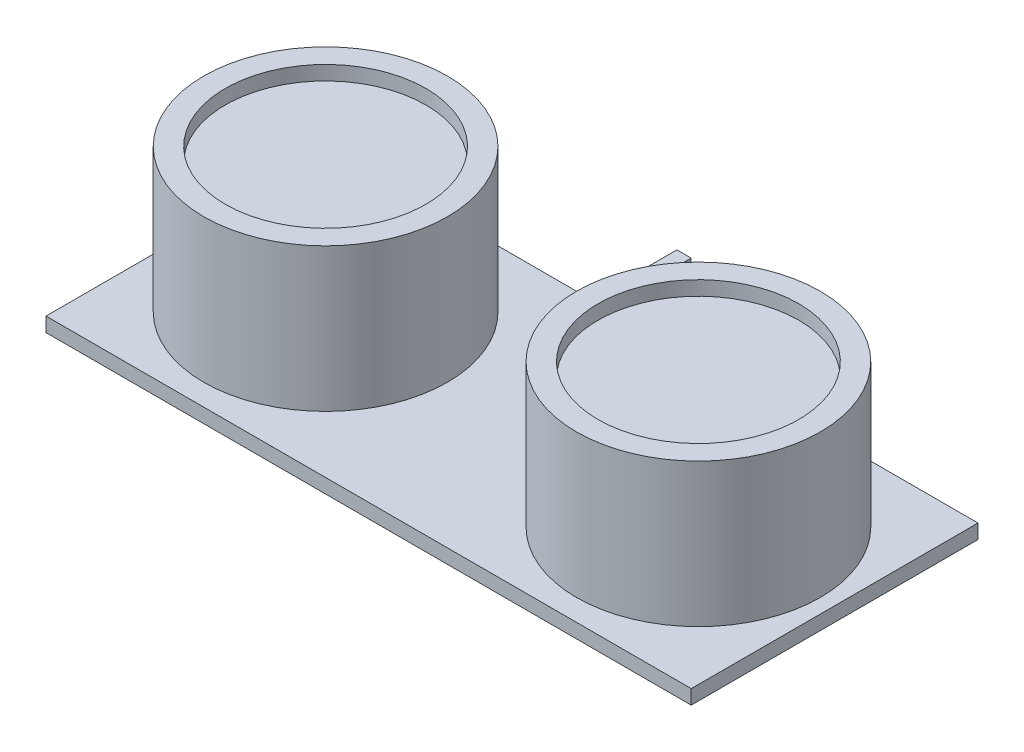
ISO-10303-21;
HEADER;
FILE_DESCRIPTION(('STEP AP214'),'2;1');
FILE_NAME('part.step','',(''),(''),'','','');
FILE_SCHEMA(('AUTOMOTIVE_DESIGN { 1 0 10303 214 1 1 1 1 }'));
ENDSEC;
DATA;
#1=APPLICATION_CONTEXT('core data for automotive mechanical design processes');
#2=APPLICATION_PROTOCOL_DEFINITION('international standard','automotive_design',2000,#1);
#3=PRODUCT_CONTEXT('',#1,'mechanical');
#4=PRODUCT('Part','Part','',(#3));
#5=PRODUCT_RELATED_PRODUCT_CATEGORY('part','',(#4));
#6=PRODUCT_DEFINITION_FORMATION('','',#4);
#7=PRODUCT_DEFINITION_CONTEXT('part definition',#1,'design');
#8=PRODUCT_DEFINITION('design','',#6,#7);
#9=PRODUCT_DEFINITION_SHAPE('','',#8);
#10=(LENGTH_UNIT() NAMED_UNIT(*) SI_UNIT(.MILLI.,.METRE.));
#11=(NAMED_UNIT(*) PLANE_ANGLE_UNIT() SI_UNIT($,.RADIAN.));
#12=(NAMED_UNIT(*) SI_UNIT($,.STERADIAN.) SOLID_ANGLE_UNIT());
#13=UNCERTAINTY_MEASURE_WITH_UNIT(LENGTH_MEASURE(1.E-05),#10,'distance_accuracy_value','');
#14=(GEOMETRIC_REPRESENTATION_CONTEXT(3) GLOBAL_UNCERTAINTY_ASSIGNED_CONTEXT((#13)) GLOBAL_UNIT_ASSIGNED_CONTEXT((#10,
#11,#12)) REPRESENTATION_CONTEXT('',''));
#15=CARTESIAN_POINT('',(0.,0.,0.));
#16=DIRECTION('',(0.,0.,1.));
#17=DIRECTION('',(1.,0.,0.));
#18=AXIS2_PLACEMENT_3D('',#15,#16,#17);
#19=CARTESIAN_POINT('',(0.,1.,0.));
#20=DIRECTION('',(0.,1.,0.));
#21=DIRECTION('',(0.,0.,1.));
#22=AXIS2_PLACEMENT_3D('',#19,#20,#21);
#23=PLANE('',#22);
#24=CARTESIAN_POINT('',(-13.,1.,0.));
#25=DIRECTION('',(0.,1.,0.));
#26=DIRECTION('',(0.,0.,1.));
#27=AXIS2_PLACEMENT_3D('',#24,#25,#26);
#28=CIRCLE('',#27,8.5);
#29=CARTESIAN_POINT('',(-13.,1.,8.5));
#30=VERTEX_POINT('',#29);
#31=EDGE_CURVE('E345',#30,#30,#28,.T.);
#32=ORIENTED_EDGE('',*,*,#31,.F.);
#33=EDGE_LOOP('',(#32));
#34=FACE_BOUND('',#33,.T.);
#35=CARTESIAN_POINT('',(13.,1.,0.));
#36=DIRECTION('',(0.,1.,0.));
#37=DIRECTION('',(0.,0.,1.));
#38=AXIS2_PLACEMENT_3D('',#35,#36,#37);
#39=CIRCLE('',#38,8.5);
#40=CARTESIAN_POINT('',(13.,1.,8.5));
#41=VERTEX_POINT('',#40);
#42=EDGE_CURVE('E339',#41,#41,#39,.T.);
#43=ORIENTED_EDGE('',*,*,#42,.F.);
#44=EDGE_LOOP('',(#43));
#45=FACE_BOUND('',#44,.T.);
#46=DIRECTION('',(1.,0.,0.));
#47=VECTOR('',#46,1.);
#48=CARTESIAN_POINT('',(0.500000000000001,1.,-8.));
#49=LINE('',#48,#47);
#50=CARTESIAN_POINT('',(0.500000000000001,1.,-8.));
#51=VERTEX_POINT('',#50);
#52=CARTESIAN_POINT('',(1.5,1.,-8.));
#53=VERTEX_POINT('',#52);
#54=EDGE_CURVE('E50',#51,#53,#49,.T.);
#55=ORIENTED_EDGE('',*,*,#54,.F.);
#56=DIRECTION('',(0.,0.,1.));
#57=VECTOR('',#56,1.);
#58=CARTESIAN_POINT('',(0.5,1.,-15.));
#59=LINE('',#58,#57);
#60=CARTESIAN_POINT('',(0.500000000000001,1.,-10.));
#61=VERTEX_POINT('',#60);
#62=EDGE_CURVE('E219',#61,#51,#59,.T.);
#63=ORIENTED_EDGE('',*,*,#62,.F.);
#64=DIRECTION('',(-1.,0.,0.));
#65=VECTOR('',#64,1.);
#66=CARTESIAN_POINT('',(-22.5,1.,-10.));
#67=LINE('',#66,#65);
#68=CARTESIAN_POINT('',(-0.500000000000007,1.,-10.));
#69=VERTEX_POINT('',#68);
#70=EDGE_CURVE('E368',#61,#69,#67,.T.);
#71=ORIENTED_EDGE('',*,*,#70,.T.);
#72=DIRECTION('',(0.,0.,-1.));
#73=VECTOR('',#72,1.);
#74=CARTESIAN_POINT('',(-0.5,1.,-15.));
#75=LINE('',#74,#73);
#76=CARTESIAN_POINT('',(-0.499999999999999,1.,-8.));
#77=VERTEX_POINT('',#76);
#78=EDGE_CURVE('E245',#77,#69,#75,.T.);
#79=ORIENTED_EDGE('',*,*,#78,.F.);
#80=DIRECTION('',(1.,0.,0.));
#81=VECTOR('',#80,1.);
#82=CARTESIAN_POINT('',(-1.5,1.,-8.));
#83=LINE('',#82,#81);
#84=CARTESIAN_POINT('',(-1.5,1.,-8.));
#85=VERTEX_POINT('',#84);
#86=EDGE_CURVE('E241',#85,#77,#83,.T.);
#87=ORIENTED_EDGE('',*,*,#86,.F.);
#88=DIRECTION('',(0.,0.,1.));
#89=VECTOR('',#88,1.);
#90=CARTESIAN_POINT('',(-1.5,1.,-15.));
#91=LINE('',#90,#89);
#92=CARTESIAN_POINT('',(-1.5,1.,-10.));
#93=VERTEX_POINT('',#92);
#94=EDGE_CURVE('E220',#93,#85,#91,.T.);
#95=ORIENTED_EDGE('',*,*,#94,.F.);
#96=CARTESIAN_POINT('',(-2.50000000000001,1.,-10.));
#97=VERTEX_POINT('',#96);
#98=EDGE_CURVE('E404',#93,#97,#67,.T.);
#99=ORIENTED_EDGE('',*,*,#98,.T.);
#100=DIRECTION('',(0.,0.,-1.));
#101=VECTOR('',#100,1.);
#102=CARTESIAN_POINT('',(-2.5,1.,-15.));
#103=LINE('',#102,#101);
#104=CARTESIAN_POINT('',(-2.5,1.,-8.));
#105=VERTEX_POINT('',#104);
#106=EDGE_CURVE('E314',#105,#97,#103,.T.);
#107=ORIENTED_EDGE('',*,*,#106,.F.);
#108=DIRECTION('',(1.,0.,0.));
#109=VECTOR('',#108,1.);
#110=CARTESIAN_POINT('',(-3.5,1.,-8.));
#111=LINE('',#110,#109);
#112=CARTESIAN_POINT('',(-3.5,1.,-8.));
#113=VERTEX_POINT('',#112);
#114=EDGE_CURVE('E310',#113,#105,#111,.T.);
#115=ORIENTED_EDGE('',*,*,#114,.F.);
#116=DIRECTION('',(0.,0.,1.));
#117=VECTOR('',#116,1.);
#118=CARTESIAN_POINT('',(-3.5,1.,-8.));
#119=LINE('',#118,#117);
#120=CARTESIAN_POINT('',(-3.5,1.,-10.));
#121=VERTEX_POINT('',#120);
#122=EDGE_CURVE('E295',#121,#113,#119,.T.);
#123=ORIENTED_EDGE('',*,*,#122,.F.);
#124=CARTESIAN_POINT('',(-22.5,1.,-10.));
#125=VERTEX_POINT('',#124);
#126=EDGE_CURVE('E362',#121,#125,#67,.T.);
#127=ORIENTED_EDGE('',*,*,#126,.T.);
#128=DIRECTION('',(0.,0.,1.));
#129=VECTOR('',#128,1.);
#130=CARTESIAN_POINT('',(-22.5,1.,-10.));
#131=LINE('',#130,#129);
#132=CARTESIAN_POINT('',(-22.5,1.,10.));
#133=VERTEX_POINT('',#132);
#134=EDGE_CURVE('E354',#125,#133,#131,.T.);
#135=ORIENTED_EDGE('',*,*,#134,.T.);
#136=DIRECTION('',(1.,0.,0.));
#137=VECTOR('',#136,1.);
#138=CARTESIAN_POINT('',(-22.5,1.,10.));
#139=LINE('',#138,#137);
#140=CARTESIAN_POINT('',(22.5,1.,10.));
#141=VERTEX_POINT('',#140);
#142=EDGE_CURVE('E357',#133,#141,#139,.T.);
#143=ORIENTED_EDGE('',*,*,#142,.T.);
#144=DIRECTION('',(0.,0.,-1.));
#145=VECTOR('',#144,1.);
#146=CARTESIAN_POINT('',(22.5,1.,-10.));
#147=LINE('',#146,#145);
#148=CARTESIAN_POINT('',(22.5,1.,-10.));
#149=VERTEX_POINT('',#148);
#150=EDGE_CURVE('E360',#141,#149,#147,.T.);
#151=ORIENTED_EDGE('',*,*,#150,.T.);
#152=CARTESIAN_POINT('',(3.49999999999999,1.,-10.));
#153=VERTEX_POINT('',#152);
#154=EDGE_CURVE('E363',#149,#153,#67,.T.);
#155=ORIENTED_EDGE('',*,*,#154,.T.);
#156=DIRECTION('',(0.,0.,-1.));
#157=VECTOR('',#156,1.);
#158=CARTESIAN_POINT('',(3.5,1.,-8.));
#159=LINE('',#158,#157);
#160=CARTESIAN_POINT('',(3.5,1.,-8.));
#161=VERTEX_POINT('',#160);
#162=EDGE_CURVE('E265',#161,#153,#159,.T.);
#163=ORIENTED_EDGE('',*,*,#162,.F.);
#164=DIRECTION('',(1.,0.,0.));
#165=VECTOR('',#164,1.);
#166=CARTESIAN_POINT('',(2.5,1.,-8.));
#167=LINE('',#166,#165);
#168=CARTESIAN_POINT('',(2.5,1.,-8.));
#169=VERTEX_POINT('',#168);
#170=EDGE_CURVE('E278',#169,#161,#167,.T.);
#171=ORIENTED_EDGE('',*,*,#170,.F.);
#172=DIRECTION('',(0.,0.,1.));
#173=VECTOR('',#172,1.);
#174=CARTESIAN_POINT('',(2.5,1.,-15.));
#175=LINE('',#174,#173);
#176=CARTESIAN_POINT('',(2.5,1.,-10.));
#177=VERTEX_POINT('',#176);
#178=EDGE_CURVE('E274',#177,#169,#175,.T.);
#179=ORIENTED_EDGE('',*,*,#178,.F.);
#180=CARTESIAN_POINT('',(1.49999999999999,1.,-10.));
#181=VERTEX_POINT('',#180);
#182=EDGE_CURVE('E406',#177,#181,#67,.T.);
#183=ORIENTED_EDGE('',*,*,#182,.T.);
#184=DIRECTION('',(0.,0.,-1.));
#185=VECTOR('',#184,1.);
#186=CARTESIAN_POINT('',(1.5,1.,-15.));
#187=LINE('',#186,#185);
#188=EDGE_CURVE('E55',#53,#181,#187,.T.);
#189=ORIENTED_EDGE('',*,*,#188,.F.);
#190=EDGE_LOOP('',(#55,#63,#71,#79,#87,#95,#99,#107,#115,#123,#127,#135,#143,#151,#155,#163,
#171,#179,#183,#189));
#191=FACE_BOUND('',#190,.T.);
#192=ADVANCED_FACE('F35',(#34,#45,#191),#23,.T.);
#193=CARTESIAN_POINT('',(-22.5,1.,-10.));
#194=DIRECTION('',(1.,0.,0.));
#195=DIRECTION('',(0.,0.,-1.));
#196=AXIS2_PLACEMENT_3D('',#193,#194,#195);
#197=PLANE('',#196);
#198=DIRECTION('',(0.,0.,1.));
#199=VECTOR('',#198,1.);
#200=CARTESIAN_POINT('',(-22.5,0.,-10.));
#201=LINE('',#200,#199);
#202=CARTESIAN_POINT('',(-22.5,0.,-10.));
#203=VERTEX_POINT('',#202);
#204=CARTESIAN_POINT('',(-22.5,0.,10.));
#205=VERTEX_POINT('',#204);
#206=EDGE_CURVE('E351',#203,#205,#201,.T.);
#207=ORIENTED_EDGE('',*,*,#206,.T.);
#208=DIRECTION('',(0.,-1.,0.));
#209=VECTOR('',#208,1.);
#210=CARTESIAN_POINT('',(-22.5,1.,10.));
#211=LINE('',#210,#209);
#212=EDGE_CURVE('E11',#133,#205,#211,.T.);
#213=ORIENTED_EDGE('',*,*,#212,.F.);
#214=ORIENTED_EDGE('',*,*,#134,.F.);
#215=DIRECTION('',(0.,-1.,0.));
#216=VECTOR('',#215,1.);
#217=CARTESIAN_POINT('',(-22.5,1.,-10.));
#218=LINE('',#217,#216);
#219=EDGE_CURVE('E366',#125,#203,#218,.T.);
#220=ORIENTED_EDGE('',*,*,#219,.T.);
#221=EDGE_LOOP('',(#207,#213,#214,#220));
#222=FACE_BOUND('',#221,.T.);
#223=ADVANCED_FACE('F37',(#222),#197,.F.);
#224=CARTESIAN_POINT('',(-22.5,1.,10.));
#225=DIRECTION('',(0.,0.,-1.));
#226=DIRECTION('',(-1.,0.,0.));
#227=AXIS2_PLACEMENT_3D('',#224,#225,#226);
#228=PLANE('',#227);
#229=DIRECTION('',(1.,0.,0.));
#230=VECTOR('',#229,1.);
#231=CARTESIAN_POINT('',(-22.5,0.,10.));
#232=LINE('',#231,#230);
#233=CARTESIAN_POINT('',(22.5,0.,10.));
#234=VERTEX_POINT('',#233);
#235=EDGE_CURVE('E372',#205,#234,#232,.T.);
#236=ORIENTED_EDGE('',*,*,#235,.T.);
#237=DIRECTION('',(0.,-1.,0.));
#238=VECTOR('',#237,1.);
#239=CARTESIAN_POINT('',(22.5,1.,10.));
#240=LINE('',#239,#238);
#241=EDGE_CURVE('E43',#141,#234,#240,.T.);
#242=ORIENTED_EDGE('',*,*,#241,.F.);
#243=ORIENTED_EDGE('',*,*,#142,.F.);
#244=ORIENTED_EDGE('',*,*,#212,.T.);
#245=EDGE_LOOP('',(#236,#242,#243,#244));
#246=FACE_BOUND('',#245,.T.);
#247=ADVANCED_FACE('F460',(#246),#228,.F.);
#248=CARTESIAN_POINT('',(22.5,1.,-10.));
#249=DIRECTION('',(-1.,0.,0.));
#250=DIRECTION('',(0.,0.,1.));
#251=AXIS2_PLACEMENT_3D('',#248,#249,#250);
#252=PLANE('',#251);
#253=DIRECTION('',(0.,0.,-1.));
#254=VECTOR('',#253,1.);
#255=CARTESIAN_POINT('',(22.5,0.,-10.));
#256=LINE('',#255,#254);
#257=CARTESIAN_POINT('',(22.5,0.,-10.));
#258=VERTEX_POINT('',#257);
#259=EDGE_CURVE('E374',#234,#258,#256,.T.);
#260=ORIENTED_EDGE('',*,*,#259,.T.);
#261=DIRECTION('',(0.,-1.,0.));
#262=VECTOR('',#261,1.);
#263=CARTESIAN_POINT('',(22.5,1.,-10.));
#264=LINE('',#263,#262);
#265=EDGE_CURVE('E379',#149,#258,#264,.T.);
#266=ORIENTED_EDGE('',*,*,#265,.F.);
#267=ORIENTED_EDGE('',*,*,#150,.F.);
#268=ORIENTED_EDGE('',*,*,#241,.T.);
#269=EDGE_LOOP('',(#260,#266,#267,#268));
#270=FACE_BOUND('',#269,.T.);
#271=ADVANCED_FACE('F386',(#270),#252,.F.);
#272=CARTESIAN_POINT('',(-22.5,1.,-10.));
#273=DIRECTION('',(0.,0.,1.));
#274=DIRECTION('',(1.,0.,0.));
#275=AXIS2_PLACEMENT_3D('',#272,#273,#274);
#276=PLANE('',#275);
#277=DIRECTION('',(-1.,0.,0.));
#278=VECTOR('',#277,1.);
#279=CARTESIAN_POINT('',(-22.5,0.,-10.));
#280=LINE('',#279,#278);
#281=EDGE_CURVE('E358',#258,#203,#280,.T.);
#282=ORIENTED_EDGE('',*,*,#281,.T.);
#283=ORIENTED_EDGE('',*,*,#219,.F.);
#284=ORIENTED_EDGE('',*,*,#126,.F.);
#285=EDGE_CURVE('E369',#97,#121,#67,.T.);
#286=ORIENTED_EDGE('',*,*,#285,.F.);
#287=ORIENTED_EDGE('',*,*,#98,.F.);
#288=EDGE_CURVE('E410',#69,#93,#67,.T.);
#289=ORIENTED_EDGE('',*,*,#288,.F.);
#290=ORIENTED_EDGE('',*,*,#70,.F.);
#291=EDGE_CURVE('E409',#181,#61,#67,.T.);
#292=ORIENTED_EDGE('',*,*,#291,.F.);
#293=ORIENTED_EDGE('',*,*,#182,.F.);
#294=EDGE_CURVE('E367',#153,#177,#67,.T.);
#295=ORIENTED_EDGE('',*,*,#294,.F.);
#296=ORIENTED_EDGE('',*,*,#154,.F.);
#297=ORIENTED_EDGE('',*,*,#265,.T.);
#298=EDGE_LOOP('',(#282,#283,#284,#286,#287,#289,#290,#292,#293,#295,#296,#297));
#299=FACE_BOUND('',#298,.T.);
#300=ADVANCED_FACE('F395',(#299),#276,.F.);
#301=CARTESIAN_POINT('',(0.,0.,0.));
#302=DIRECTION('',(0.,1.,0.));
#303=DIRECTION('',(0.,0.,1.));
#304=AXIS2_PLACEMENT_3D('',#301,#302,#303);
#305=PLANE('',#304);
#306=ORIENTED_EDGE('',*,*,#206,.F.);
#307=ORIENTED_EDGE('',*,*,#281,.F.);
#308=ORIENTED_EDGE('',*,*,#259,.F.);
#309=ORIENTED_EDGE('',*,*,#235,.F.);
#310=EDGE_LOOP('',(#306,#307,#308,#309));
#311=FACE_BOUND('',#310,.T.);
#312=ADVANCED_FACE('F392',(#311),#305,.F.);
#313=CARTESIAN_POINT('',(-13.,11.,0.));
#314=DIRECTION('',(0.,-1.,0.));
#315=DIRECTION('',(0.,0.,-1.));
#316=AXIS2_PLACEMENT_3D('',#313,#314,#315);
#317=CYLINDRICAL_SURFACE('',#316,8.5);
#318=CARTESIAN_POINT('',(-13.,11.,0.));
#319=DIRECTION('',(0.,1.,0.));
#320=DIRECTION('',(0.,0.,1.));
#321=AXIS2_PLACEMENT_3D('',#318,#319,#320);
#322=CIRCLE('',#321,8.5);
#323=CARTESIAN_POINT('',(-13.,11.,8.5));
#324=VERTEX_POINT('',#323);
#325=EDGE_CURVE('E348',#324,#324,#322,.T.);
#326=ORIENTED_EDGE('',*,*,#325,.F.);
#327=EDGE_LOOP('',(#326));
#328=FACE_BOUND('',#327,.T.);
#329=ORIENTED_EDGE('',*,*,#31,.T.);
#330=EDGE_LOOP('',(#329));
#331=FACE_BOUND('',#330,.T.);
#332=ADVANCED_FACE('F465',(#328,#331),#317,.T.);
#333=CARTESIAN_POINT('',(-13.,11.,0.));
#334=DIRECTION('',(0.,1.,0.));
#335=DIRECTION('',(0.,0.,1.));
#336=AXIS2_PLACEMENT_3D('',#333,#334,#335);
#337=PLANE('',#336);
#338=CARTESIAN_POINT('',(-13.,11.,0.));
#339=DIRECTION('',(0.,1.,0.));
#340=DIRECTION('',(0.,0.,1.));
#341=AXIS2_PLACEMENT_3D('',#338,#339,#340);
#342=CIRCLE('',#341,7.);
#343=CARTESIAN_POINT('',(-13.,11.,7.));
#344=VERTEX_POINT('',#343);
#345=EDGE_CURVE('E333',#344,#344,#342,.T.);
#346=ORIENTED_EDGE('',*,*,#345,.F.);
#347=EDGE_LOOP('',(#346));
#348=FACE_BOUND('',#347,.T.);
#349=ORIENTED_EDGE('',*,*,#325,.T.);
#350=EDGE_LOOP('',(#349));
#351=FACE_BOUND('',#350,.T.);
#352=ADVANCED_FACE('F497',(#348,#351),#337,.T.);
#353=CARTESIAN_POINT('',(13.,11.,0.));
#354=DIRECTION('',(0.,-1.,0.));
#355=DIRECTION('',(0.,0.,-1.));
#356=AXIS2_PLACEMENT_3D('',#353,#354,#355);
#357=CYLINDRICAL_SURFACE('',#356,8.5);
#358=CARTESIAN_POINT('',(13.,11.,0.));
#359=DIRECTION('',(0.,1.,0.));
#360=DIRECTION('',(0.,0.,1.));
#361=AXIS2_PLACEMENT_3D('',#358,#359,#360);
#362=CIRCLE('',#361,8.5);
#363=CARTESIAN_POINT('',(13.,11.,8.5));
#364=VERTEX_POINT('',#363);
#365=EDGE_CURVE('E342',#364,#364,#362,.T.);
#366=ORIENTED_EDGE('',*,*,#365,.F.);
#367=EDGE_LOOP('',(#366));
#368=FACE_BOUND('',#367,.T.);
#369=ORIENTED_EDGE('',*,*,#42,.T.);
#370=EDGE_LOOP('',(#369));
#371=FACE_BOUND('',#370,.T.);
#372=ADVANCED_FACE('F504',(#368,#371),#357,.T.);
#373=CARTESIAN_POINT('',(13.,11.,0.));
#374=DIRECTION('',(0.,1.,0.));
#375=DIRECTION('',(0.,0.,1.));
#376=AXIS2_PLACEMENT_3D('',#373,#374,#375);
#377=PLANE('',#376);
#378=CARTESIAN_POINT('',(13.,11.,0.));
#379=DIRECTION('',(0.,1.,0.));
#380=DIRECTION('',(0.,0.,1.));
#381=AXIS2_PLACEMENT_3D('',#378,#379,#380);
#382=CIRCLE('',#381,7.);
#383=CARTESIAN_POINT('',(13.,11.,7.));
#384=VERTEX_POINT('',#383);
#385=EDGE_CURVE('E329',#384,#384,#382,.T.);
#386=ORIENTED_EDGE('',*,*,#385,.F.);
#387=EDGE_LOOP('',(#386));
#388=FACE_BOUND('',#387,.T.);
#389=ORIENTED_EDGE('',*,*,#365,.T.);
#390=EDGE_LOOP('',(#389));
#391=FACE_BOUND('',#390,.T.);
#392=ADVANCED_FACE('F512',(#388,#391),#377,.T.);
#393=CARTESIAN_POINT('',(-13.,10.,0.));
#394=DIRECTION('',(0.,1.,0.));
#395=DIRECTION('',(0.,0.,1.));
#396=AXIS2_PLACEMENT_3D('',#393,#394,#395);
#397=CYLINDRICAL_SURFACE('',#396,7.);
#398=CARTESIAN_POINT('',(-13.,10.,0.));
#399=DIRECTION('',(0.,1.,0.));
#400=DIRECTION('',(0.,0.,1.));
#401=AXIS2_PLACEMENT_3D('',#398,#399,#400);
#402=CIRCLE('',#401,7.);
#403=CARTESIAN_POINT('',(-13.,10.,7.));
#404=VERTEX_POINT('',#403);
#405=EDGE_CURVE('E336',#404,#404,#402,.T.);
#406=ORIENTED_EDGE('',*,*,#405,.F.);
#407=EDGE_LOOP('',(#406));
#408=FACE_BOUND('',#407,.T.);
#409=ORIENTED_EDGE('',*,*,#345,.T.);
#410=EDGE_LOOP('',(#409));
#411=FACE_BOUND('',#410,.T.);
#412=ADVANCED_FACE('F519',(#408,#411),#397,.F.);
#413=CARTESIAN_POINT('',(-13.,10.,0.));
#414=DIRECTION('',(0.,1.,0.));
#415=DIRECTION('',(0.,0.,1.));
#416=AXIS2_PLACEMENT_3D('',#413,#414,#415);
#417=PLANE('',#416);
#418=ORIENTED_EDGE('',*,*,#405,.T.);
#419=EDGE_LOOP('',(#418));
#420=FACE_BOUND('',#419,.T.);
#421=ADVANCED_FACE('F526',(#420),#417,.T.);
#422=CARTESIAN_POINT('',(13.,10.,0.));
#423=DIRECTION('',(0.,1.,0.));
#424=DIRECTION('',(0.,0.,1.));
#425=AXIS2_PLACEMENT_3D('',#422,#423,#424);
#426=CYLINDRICAL_SURFACE('',#425,7.);
#427=CARTESIAN_POINT('',(13.,10.,0.));
#428=DIRECTION('',(0.,1.,0.));
#429=DIRECTION('',(0.,0.,1.));
#430=AXIS2_PLACEMENT_3D('',#427,#428,#429);
#431=CIRCLE('',#430,7.);
#432=CARTESIAN_POINT('',(13.,10.,7.));
#433=VERTEX_POINT('',#432);
#434=EDGE_CURVE('E330',#433,#433,#431,.T.);
#435=ORIENTED_EDGE('',*,*,#434,.F.);
#436=EDGE_LOOP('',(#435));
#437=FACE_BOUND('',#436,.T.);
#438=ORIENTED_EDGE('',*,*,#385,.T.);
#439=EDGE_LOOP('',(#438));
#440=FACE_BOUND('',#439,.T.);
#441=ADVANCED_FACE('F535',(#437,#440),#426,.F.);
#442=CARTESIAN_POINT('',(13.,10.,0.));
#443=DIRECTION('',(0.,1.,0.));
#444=DIRECTION('',(0.,0.,1.));
#445=AXIS2_PLACEMENT_3D('',#442,#443,#444);
#446=PLANE('',#445);
#447=ORIENTED_EDGE('',*,*,#434,.T.);
#448=EDGE_LOOP('',(#447));
#449=FACE_BOUND('',#448,.T.);
#450=ADVANCED_FACE('F543',(#449),#446,.T.);
#451=CARTESIAN_POINT('',(0.,1.,0.));
#452=DIRECTION('',(0.,-1.,0.));
#453=DIRECTION('',(0.,0.,-1.));
#454=AXIS2_PLACEMENT_3D('',#451,#452,#453);
#455=PLANE('',#454);
#456=ORIENTED_EDGE('',*,*,#285,.T.);
#457=CARTESIAN_POINT('',(-3.5,1.,-15.));
#458=VERTEX_POINT('',#457);
#459=EDGE_CURVE('E307',#458,#121,#119,.T.);
#460=ORIENTED_EDGE('',*,*,#459,.F.);
#461=DIRECTION('',(-1.,0.,0.));
#462=VECTOR('',#461,1.);
#463=CARTESIAN_POINT('',(-3.5,1.,-15.));
#464=LINE('',#463,#462);
#465=CARTESIAN_POINT('',(-2.5,1.,-15.));
#466=VERTEX_POINT('',#465);
#467=EDGE_CURVE('E300',#466,#458,#464,.T.);
#468=ORIENTED_EDGE('',*,*,#467,.F.);
#469=EDGE_CURVE('E313',#97,#466,#103,.T.);
#470=ORIENTED_EDGE('',*,*,#469,.F.);
#471=EDGE_LOOP('',(#456,#460,#468,#470));
#472=FACE_BOUND('',#471,.T.);
#473=ADVANCED_FACE('F424',(#472),#455,.T.);
#474=CARTESIAN_POINT('',(-3.5,2.,-8.));
#475=DIRECTION('',(1.,0.,0.));
#476=DIRECTION('',(0.,0.,-1.));
#477=AXIS2_PLACEMENT_3D('',#474,#475,#476);
#478=PLANE('',#477);
#479=ORIENTED_EDGE('',*,*,#459,.T.);
#480=ORIENTED_EDGE('',*,*,#122,.T.);
#481=DIRECTION('',(0.,-1.,0.));
#482=VECTOR('',#481,1.);
#483=CARTESIAN_POINT('',(-3.5,2.,-8.));
#484=LINE('',#483,#482);
#485=CARTESIAN_POINT('',(-3.5,2.,-8.));
#486=VERTEX_POINT('',#485);
#487=EDGE_CURVE('E326',#486,#113,#484,.T.);
#488=ORIENTED_EDGE('',*,*,#487,.F.);
#489=DIRECTION('',(0.,0.,1.));
#490=VECTOR('',#489,1.);
#491=CARTESIAN_POINT('',(-3.5,2.,-8.));
#492=LINE('',#491,#490);
#493=CARTESIAN_POINT('',(-3.5,2.,-15.));
#494=VERTEX_POINT('',#493);
#495=EDGE_CURVE('E296',#494,#486,#492,.T.);
#496=ORIENTED_EDGE('',*,*,#495,.F.);
#497=DIRECTION('',(0.,-1.,0.));
#498=VECTOR('',#497,1.);
#499=CARTESIAN_POINT('',(-3.5,2.,-15.));
#500=LINE('',#499,#498);
#501=EDGE_CURVE('E306',#494,#458,#500,.T.);
#502=ORIENTED_EDGE('',*,*,#501,.T.);
#503=EDGE_LOOP('',(#479,#480,#488,#496,#502));
#504=FACE_BOUND('',#503,.T.);
#505=ADVANCED_FACE('F434',(#504),#478,.F.);
#506=CARTESIAN_POINT('',(-3.5,2.,-8.));
#507=DIRECTION('',(0.,0.,-1.));
#508=DIRECTION('',(-1.,0.,0.));
#509=AXIS2_PLACEMENT_3D('',#506,#507,#508);
#510=PLANE('',#509);
#511=ORIENTED_EDGE('',*,*,#114,.T.);
#512=DIRECTION('',(0.,-1.,0.));
#513=VECTOR('',#512,1.);
#514=CARTESIAN_POINT('',(-2.5,2.,-8.));
#515=LINE('',#514,#513);
#516=CARTESIAN_POINT('',(-2.5,2.,-8.));
#517=VERTEX_POINT('',#516);
#518=EDGE_CURVE('E323',#517,#105,#515,.T.);
#519=ORIENTED_EDGE('',*,*,#518,.F.);
#520=DIRECTION('',(1.,0.,0.));
#521=VECTOR('',#520,1.);
#522=CARTESIAN_POINT('',(-3.5,2.,-8.));
#523=LINE('',#522,#521);
#524=EDGE_CURVE('E299',#486,#517,#523,.T.);
#525=ORIENTED_EDGE('',*,*,#524,.F.);
#526=ORIENTED_EDGE('',*,*,#487,.T.);
#527=EDGE_LOOP('',(#511,#519,#525,#526));
#528=FACE_BOUND('',#527,.T.);
#529=ADVANCED_FACE('F431',(#528),#510,.F.);
#530=CARTESIAN_POINT('',(-2.5,2.,-15.));
#531=DIRECTION('',(-1.,0.,0.));
#532=DIRECTION('',(0.,0.,1.));
#533=AXIS2_PLACEMENT_3D('',#530,#531,#532);
#534=PLANE('',#533);
#535=ORIENTED_EDGE('',*,*,#106,.T.);
#536=ORIENTED_EDGE('',*,*,#469,.T.);
#537=DIRECTION('',(0.,-1.,0.));
#538=VECTOR('',#537,1.);
#539=CARTESIAN_POINT('',(-2.5,2.,-15.));
#540=LINE('',#539,#538);
#541=CARTESIAN_POINT('',(-2.5,2.,-15.));
#542=VERTEX_POINT('',#541);
#543=EDGE_CURVE('E320',#542,#466,#540,.T.);
#544=ORIENTED_EDGE('',*,*,#543,.F.);
#545=DIRECTION('',(0.,0.,-1.));
#546=VECTOR('',#545,1.);
#547=CARTESIAN_POINT('',(-2.5,2.,-15.));
#548=LINE('',#547,#546);
#549=EDGE_CURVE('E302',#517,#542,#548,.T.);
#550=ORIENTED_EDGE('',*,*,#549,.F.);
#551=ORIENTED_EDGE('',*,*,#518,.T.);
#552=EDGE_LOOP('',(#535,#536,#544,#550,#551));
#553=FACE_BOUND('',#552,.T.);
#554=ADVANCED_FACE('F427',(#553),#534,.F.);
#555=CARTESIAN_POINT('',(-3.5,2.,-15.));
#556=DIRECTION('',(0.,0.,1.));
#557=DIRECTION('',(1.,0.,0.));
#558=AXIS2_PLACEMENT_3D('',#555,#556,#557);
#559=PLANE('',#558);
#560=ORIENTED_EDGE('',*,*,#467,.T.);
#561=ORIENTED_EDGE('',*,*,#501,.F.);
#562=DIRECTION('',(-1.,0.,0.));
#563=VECTOR('',#562,1.);
#564=CARTESIAN_POINT('',(-3.5,2.,-15.));
#565=LINE('',#564,#563);
#566=EDGE_CURVE('E304',#542,#494,#565,.T.);
#567=ORIENTED_EDGE('',*,*,#566,.F.);
#568=ORIENTED_EDGE('',*,*,#543,.T.);
#569=EDGE_LOOP('',(#560,#561,#567,#568));
#570=FACE_BOUND('',#569,.T.);
#571=ADVANCED_FACE('F439',(#570),#559,.F.);
#572=CARTESIAN_POINT('',(0.,2.,0.));
#573=DIRECTION('',(0.,-1.,0.));
#574=DIRECTION('',(0.,0.,-1.));
#575=AXIS2_PLACEMENT_3D('',#572,#573,#574);
#576=PLANE('',#575);
#577=ORIENTED_EDGE('',*,*,#495,.T.);
#578=ORIENTED_EDGE('',*,*,#524,.T.);
#579=ORIENTED_EDGE('',*,*,#549,.T.);
#580=ORIENTED_EDGE('',*,*,#566,.T.);
#581=EDGE_LOOP('',(#577,#578,#579,#580));
#582=FACE_BOUND('',#581,.T.);
#583=ADVANCED_FACE('F441',(#582),#576,.F.);
#584=CARTESIAN_POINT('',(0.,1.,0.));
#585=DIRECTION('',(0.,1.,0.));
#586=DIRECTION('',(0.,0.,1.));
#587=AXIS2_PLACEMENT_3D('',#584,#585,#586);
#588=PLANE('',#587);
#589=CARTESIAN_POINT('',(3.5,1.,-15.));
#590=VERTEX_POINT('',#589);
#591=EDGE_CURVE('E281',#153,#590,#159,.T.);
#592=ORIENTED_EDGE('',*,*,#591,.F.);
#593=ORIENTED_EDGE('',*,*,#294,.T.);
#594=CARTESIAN_POINT('',(2.5,1.,-15.));
#595=VERTEX_POINT('',#594);
#596=EDGE_CURVE('E275',#595,#177,#175,.T.);
#597=ORIENTED_EDGE('',*,*,#596,.F.);
#598=DIRECTION('',(-1.,0.,0.));
#599=VECTOR('',#598,1.);
#600=CARTESIAN_POINT('',(2.5,1.,-15.));
#601=LINE('',#600,#599);
#602=EDGE_CURVE('E260',#590,#595,#601,.T.);
#603=ORIENTED_EDGE('',*,*,#602,.F.);
#604=EDGE_LOOP('',(#592,#593,#597,#603));
#605=FACE_BOUND('',#604,.T.);
#606=ADVANCED_FACE('F443',(#605),#588,.F.);
#607=CARTESIAN_POINT('',(2.5,2.,-15.));
#608=DIRECTION('',(0.,0.,1.));
#609=DIRECTION('',(1.,0.,0.));
#610=AXIS2_PLACEMENT_3D('',#607,#608,#609);
#611=PLANE('',#610);
#612=ORIENTED_EDGE('',*,*,#602,.T.);
#613=DIRECTION('',(0.,-1.,0.));
#614=VECTOR('',#613,1.);
#615=CARTESIAN_POINT('',(2.5,2.,-15.));
#616=LINE('',#615,#614);
#617=CARTESIAN_POINT('',(2.5,2.,-15.));
#618=VERTEX_POINT('',#617);
#619=EDGE_CURVE('E292',#618,#595,#616,.T.);
#620=ORIENTED_EDGE('',*,*,#619,.F.);
#621=DIRECTION('',(-1.,0.,0.));
#622=VECTOR('',#621,1.);
#623=CARTESIAN_POINT('',(2.5,2.,-15.));
#624=LINE('',#623,#622);
#625=CARTESIAN_POINT('',(3.5,2.,-15.));
#626=VERTEX_POINT('',#625);
#627=EDGE_CURVE('E261',#626,#618,#624,.T.);
#628=ORIENTED_EDGE('',*,*,#627,.F.);
#629=DIRECTION('',(0.,-1.,0.));
#630=VECTOR('',#629,1.);
#631=CARTESIAN_POINT('',(3.5,2.,-15.));
#632=LINE('',#631,#630);
#633=EDGE_CURVE('E271',#626,#590,#632,.T.);
#634=ORIENTED_EDGE('',*,*,#633,.T.);
#635=EDGE_LOOP('',(#612,#620,#628,#634));
#636=FACE_BOUND('',#635,.T.);
#637=ADVANCED_FACE('F449',(#636),#611,.F.);
#638=CARTESIAN_POINT('',(2.5,2.,-15.));
#639=DIRECTION('',(1.,0.,0.));
#640=DIRECTION('',(0.,0.,-1.));
#641=AXIS2_PLACEMENT_3D('',#638,#639,#640);
#642=PLANE('',#641);
#643=ORIENTED_EDGE('',*,*,#596,.T.);
#644=ORIENTED_EDGE('',*,*,#178,.T.);
#645=DIRECTION('',(0.,-1.,0.));
#646=VECTOR('',#645,1.);
#647=CARTESIAN_POINT('',(2.5,2.,-8.));
#648=LINE('',#647,#646);
#649=CARTESIAN_POINT('',(2.5,2.,-8.));
#650=VERTEX_POINT('',#649);
#651=EDGE_CURVE('E289',#650,#169,#648,.T.);
#652=ORIENTED_EDGE('',*,*,#651,.F.);
#653=DIRECTION('',(0.,0.,1.));
#654=VECTOR('',#653,1.);
#655=CARTESIAN_POINT('',(2.5,2.,-15.));
#656=LINE('',#655,#654);
#657=EDGE_CURVE('E264',#618,#650,#656,.T.);
#658=ORIENTED_EDGE('',*,*,#657,.F.);
#659=ORIENTED_EDGE('',*,*,#619,.T.);
#660=EDGE_LOOP('',(#643,#644,#652,#658,#659));
#661=FACE_BOUND('',#660,.T.);
#662=ADVANCED_FACE('F596',(#661),#642,.F.);
#663=CARTESIAN_POINT('',(2.5,2.,-8.));
#664=DIRECTION('',(0.,0.,-1.));
#665=DIRECTION('',(-1.,0.,0.));
#666=AXIS2_PLACEMENT_3D('',#663,#664,#665);
#667=PLANE('',#666);
#668=ORIENTED_EDGE('',*,*,#170,.T.);
#669=DIRECTION('',(0.,-1.,0.));
#670=VECTOR('',#669,1.);
#671=CARTESIAN_POINT('',(3.5,2.,-8.));
#672=LINE('',#671,#670);
#673=CARTESIAN_POINT('',(3.5,2.,-8.));
#674=VERTEX_POINT('',#673);
#675=EDGE_CURVE('E286',#674,#161,#672,.T.);
#676=ORIENTED_EDGE('',*,*,#675,.F.);
#677=DIRECTION('',(1.,0.,0.));
#678=VECTOR('',#677,1.);
#679=CARTESIAN_POINT('',(2.5,2.,-8.));
#680=LINE('',#679,#678);
#681=EDGE_CURVE('E267',#650,#674,#680,.T.);
#682=ORIENTED_EDGE('',*,*,#681,.F.);
#683=ORIENTED_EDGE('',*,*,#651,.T.);
#684=EDGE_LOOP('',(#668,#676,#682,#683));
#685=FACE_BOUND('',#684,.T.);
#686=ADVANCED_FACE('F605',(#685),#667,.F.);
#687=CARTESIAN_POINT('',(3.5,2.,-8.));
#688=DIRECTION('',(-1.,0.,0.));
#689=DIRECTION('',(0.,0.,1.));
#690=AXIS2_PLACEMENT_3D('',#687,#688,#689);
#691=PLANE('',#690);
#692=ORIENTED_EDGE('',*,*,#162,.T.);
#693=ORIENTED_EDGE('',*,*,#591,.T.);
#694=ORIENTED_EDGE('',*,*,#633,.F.);
#695=DIRECTION('',(0.,0.,-1.));
#696=VECTOR('',#695,1.);
#697=CARTESIAN_POINT('',(3.5,2.,-8.));
#698=LINE('',#697,#696);
#699=EDGE_CURVE('E269',#674,#626,#698,.T.);
#700=ORIENTED_EDGE('',*,*,#699,.F.);
#701=ORIENTED_EDGE('',*,*,#675,.T.);
#702=EDGE_LOOP('',(#692,#693,#694,#700,#701));
#703=FACE_BOUND('',#702,.T.);
#704=ADVANCED_FACE('F615',(#703),#691,.F.);
#705=CARTESIAN_POINT('',(0.,2.,0.));
#706=DIRECTION('',(0.,1.,0.));
#707=DIRECTION('',(0.,0.,1.));
#708=AXIS2_PLACEMENT_3D('',#705,#706,#707);
#709=PLANE('',#708);
#710=ORIENTED_EDGE('',*,*,#627,.T.);
#711=ORIENTED_EDGE('',*,*,#657,.T.);
#712=ORIENTED_EDGE('',*,*,#681,.T.);
#713=ORIENTED_EDGE('',*,*,#699,.T.);
#714=EDGE_LOOP('',(#710,#711,#712,#713));
#715=FACE_BOUND('',#714,.T.);
#716=ADVANCED_FACE('F625',(#715),#709,.T.);
#717=CARTESIAN_POINT('',(0.,1.,0.));
#718=DIRECTION('',(0.,1.,0.));
#719=DIRECTION('',(0.,0.,1.));
#720=AXIS2_PLACEMENT_3D('',#717,#718,#719);
#721=PLANE('',#720);
#722=CARTESIAN_POINT('',(-0.5,1.,-15.));
#723=VERTEX_POINT('',#722);
#724=EDGE_CURVE('E244',#69,#723,#75,.T.);
#725=ORIENTED_EDGE('',*,*,#724,.F.);
#726=ORIENTED_EDGE('',*,*,#288,.T.);
#727=CARTESIAN_POINT('',(-1.5,1.,-15.));
#728=VERTEX_POINT('',#727);
#729=EDGE_CURVE('E223',#728,#93,#91,.T.);
#730=ORIENTED_EDGE('',*,*,#729,.F.);
#731=DIRECTION('',(-1.,0.,0.));
#732=VECTOR('',#731,1.);
#733=CARTESIAN_POINT('',(-1.5,1.,-15.));
#734=LINE('',#733,#732);
#735=EDGE_CURVE('E233',#723,#728,#734,.T.);
#736=ORIENTED_EDGE('',*,*,#735,.F.);
#737=EDGE_LOOP('',(#725,#726,#730,#736));
#738=FACE_BOUND('',#737,.T.);
#739=ADVANCED_FACE('F635',(#738),#721,.F.);
#740=CARTESIAN_POINT('',(-1.5,2.,-15.));
#741=DIRECTION('',(1.,0.,0.));
#742=DIRECTION('',(0.,0.,-1.));
#743=AXIS2_PLACEMENT_3D('',#740,#741,#742);
#744=PLANE('',#743);
#745=ORIENTED_EDGE('',*,*,#729,.T.);
#746=ORIENTED_EDGE('',*,*,#94,.T.);
#747=DIRECTION('',(0.,-1.,0.));
#748=VECTOR('',#747,1.);
#749=CARTESIAN_POINT('',(-1.5,2.,-8.));
#750=LINE('',#749,#748);
#751=CARTESIAN_POINT('',(-1.5,2.,-8.));
#752=VERTEX_POINT('',#751);
#753=EDGE_CURVE('E257',#752,#85,#750,.T.);
#754=ORIENTED_EDGE('',*,*,#753,.F.);
#755=DIRECTION('',(0.,0.,1.));
#756=VECTOR('',#755,1.);
#757=CARTESIAN_POINT('',(-1.5,2.,-15.));
#758=LINE('',#757,#756);
#759=CARTESIAN_POINT('',(-1.5,2.,-15.));
#760=VERTEX_POINT('',#759);
#761=EDGE_CURVE('E229',#760,#752,#758,.T.);
#762=ORIENTED_EDGE('',*,*,#761,.F.);
#763=DIRECTION('',(0.,-1.,0.));
#764=VECTOR('',#763,1.);
#765=CARTESIAN_POINT('',(-1.5,2.,-15.));
#766=LINE('',#765,#764);
#767=EDGE_CURVE('E238',#760,#728,#766,.T.);
#768=ORIENTED_EDGE('',*,*,#767,.T.);
#769=EDGE_LOOP('',(#745,#746,#754,#762,#768));
#770=FACE_BOUND('',#769,.T.);
#771=ADVANCED_FACE('F645',(#770),#744,.F.);
#772=CARTESIAN_POINT('',(-1.5,2.,-8.));
#773=DIRECTION('',(0.,0.,-1.));
#774=DIRECTION('',(-1.,0.,0.));
#775=AXIS2_PLACEMENT_3D('',#772,#773,#774);
#776=PLANE('',#775);
#777=ORIENTED_EDGE('',*,*,#86,.T.);
#778=DIRECTION('',(0.,-1.,0.));
#779=VECTOR('',#778,1.);
#780=CARTESIAN_POINT('',(-0.499999999999999,2.,-8.));
#781=LINE('',#780,#779);
#782=CARTESIAN_POINT('',(-0.499999999999999,2.,-8.));
#783=VERTEX_POINT('',#782);
#784=EDGE_CURVE('E254',#783,#77,#781,.T.);
#785=ORIENTED_EDGE('',*,*,#784,.F.);
#786=DIRECTION('',(1.,0.,0.));
#787=VECTOR('',#786,1.);
#788=CARTESIAN_POINT('',(-1.5,2.,-8.));
#789=LINE('',#788,#787);
#790=EDGE_CURVE('E232',#752,#783,#789,.T.);
#791=ORIENTED_EDGE('',*,*,#790,.F.);
#792=ORIENTED_EDGE('',*,*,#753,.T.);
#793=EDGE_LOOP('',(#777,#785,#791,#792));
#794=FACE_BOUND('',#793,.T.);
#795=ADVANCED_FACE('F654',(#794),#776,.F.);
#796=CARTESIAN_POINT('',(-0.5,2.,-15.));
#797=DIRECTION('',(-1.,0.,0.));
#798=DIRECTION('',(0.,0.,1.));
#799=AXIS2_PLACEMENT_3D('',#796,#797,#798);
#800=PLANE('',#799);
#801=ORIENTED_EDGE('',*,*,#78,.T.);
#802=ORIENTED_EDGE('',*,*,#724,.T.);
#803=DIRECTION('',(0.,-1.,0.));
#804=VECTOR('',#803,1.);
#805=CARTESIAN_POINT('',(-0.5,2.,-15.));
#806=LINE('',#805,#804);
#807=CARTESIAN_POINT('',(-0.5,2.,-15.));
#808=VERTEX_POINT('',#807);
#809=EDGE_CURVE('E251',#808,#723,#806,.T.);
#810=ORIENTED_EDGE('',*,*,#809,.F.);
#811=DIRECTION('',(0.,0.,-1.));
#812=VECTOR('',#811,1.);
#813=CARTESIAN_POINT('',(-0.5,2.,-15.));
#814=LINE('',#813,#812);
#815=EDGE_CURVE('E235',#783,#808,#814,.T.);
#816=ORIENTED_EDGE('',*,*,#815,.F.);
#817=ORIENTED_EDGE('',*,*,#784,.T.);
#818=EDGE_LOOP('',(#801,#802,#810,#816,#817));
#819=FACE_BOUND('',#818,.T.);
#820=ADVANCED_FACE('F664',(#819),#800,.F.);
#821=CARTESIAN_POINT('',(-1.5,2.,-15.));
#822=DIRECTION('',(0.,0.,1.));
#823=DIRECTION('',(1.,0.,0.));
#824=AXIS2_PLACEMENT_3D('',#821,#822,#823);
#825=PLANE('',#824);
#826=ORIENTED_EDGE('',*,*,#735,.T.);
#827=ORIENTED_EDGE('',*,*,#767,.F.);
#828=DIRECTION('',(-1.,0.,0.));
#829=VECTOR('',#828,1.);
#830=CARTESIAN_POINT('',(-1.5,2.,-15.));
#831=LINE('',#830,#829);
#832=EDGE_CURVE('E237',#808,#760,#831,.T.);
#833=ORIENTED_EDGE('',*,*,#832,.F.);
#834=ORIENTED_EDGE('',*,*,#809,.T.);
#835=EDGE_LOOP('',(#826,#827,#833,#834));
#836=FACE_BOUND('',#835,.T.);
#837=ADVANCED_FACE('F674',(#836),#825,.F.);
#838=CARTESIAN_POINT('',(0.,2.,0.));
#839=DIRECTION('',(0.,1.,0.));
#840=DIRECTION('',(0.,0.,1.));
#841=AXIS2_PLACEMENT_3D('',#838,#839,#840);
#842=PLANE('',#841);
#843=ORIENTED_EDGE('',*,*,#761,.T.);
#844=ORIENTED_EDGE('',*,*,#790,.T.);
#845=ORIENTED_EDGE('',*,*,#815,.T.);
#846=ORIENTED_EDGE('',*,*,#832,.T.);
#847=EDGE_LOOP('',(#843,#844,#845,#846));
#848=FACE_BOUND('',#847,.T.);
#849=ADVANCED_FACE('F684',(#848),#842,.T.);
#850=CARTESIAN_POINT('',(0.,1.,0.));
#851=DIRECTION('',(0.,1.,0.));
#852=DIRECTION('',(0.,0.,1.));
#853=AXIS2_PLACEMENT_3D('',#850,#851,#852);
#854=PLANE('',#853);
#855=CARTESIAN_POINT('',(1.5,1.,-15.));
#856=VERTEX_POINT('',#855);
#857=EDGE_CURVE('E761',#181,#856,#187,.T.);
#858=ORIENTED_EDGE('',*,*,#857,.F.);
#859=ORIENTED_EDGE('',*,*,#291,.T.);
#860=CARTESIAN_POINT('',(0.5,1.,-15.));
#861=VERTEX_POINT('',#860);
#862=EDGE_CURVE('E758',#861,#61,#59,.T.);
#863=ORIENTED_EDGE('',*,*,#862,.F.);
#864=DIRECTION('',(-1.,0.,0.));
#865=VECTOR('',#864,1.);
#866=CARTESIAN_POINT('',(0.5,1.,-15.));
#867=LINE('',#866,#865);
#868=EDGE_CURVE('E215',#856,#861,#867,.T.);
#869=ORIENTED_EDGE('',*,*,#868,.F.);
#870=EDGE_LOOP('',(#858,#859,#863,#869));
#871=FACE_BOUND('',#870,.T.);
#872=ADVANCED_FACE('F694',(#871),#854,.F.);
#873=CARTESIAN_POINT('',(0.5,2.,-15.));
#874=DIRECTION('',(1.,0.,0.));
#875=DIRECTION('',(0.,0.,-1.));
#876=AXIS2_PLACEMENT_3D('',#873,#874,#875);
#877=PLANE('',#876);
#878=ORIENTED_EDGE('',*,*,#862,.T.);
#879=ORIENTED_EDGE('',*,*,#62,.T.);
#880=DIRECTION('',(0.,-1.,0.));
#881=VECTOR('',#880,1.);
#882=CARTESIAN_POINT('',(0.500000000000001,2.,-8.));
#883=LINE('',#882,#881);
#884=CARTESIAN_POINT('',(0.500000000000001,2.,-8.));
#885=VERTEX_POINT('',#884);
#886=EDGE_CURVE('E200',#885,#51,#883,.T.);
#887=ORIENTED_EDGE('',*,*,#886,.F.);
#888=DIRECTION('',(0.,0.,1.));
#889=VECTOR('',#888,1.);
#890=CARTESIAN_POINT('',(0.5,2.,-15.));
#891=LINE('',#890,#889);
#892=CARTESIAN_POINT('',(0.5,2.,-15.));
#893=VERTEX_POINT('',#892);
#894=EDGE_CURVE('E206',#893,#885,#891,.T.);
#895=ORIENTED_EDGE('',*,*,#894,.F.);
#896=DIRECTION('',(0.,-1.,0.));
#897=VECTOR('',#896,1.);
#898=CARTESIAN_POINT('',(0.5,2.,-15.));
#899=LINE('',#898,#897);
#900=EDGE_CURVE('E754',#893,#861,#899,.T.);
#901=ORIENTED_EDGE('',*,*,#900,.T.);
#902=EDGE_LOOP('',(#878,#879,#887,#895,#901));
#903=FACE_BOUND('',#902,.T.);
#904=ADVANCED_FACE('F218',(#903),#877,.F.);
#905=CARTESIAN_POINT('',(0.500000000000001,2.,-8.));
#906=DIRECTION('',(0.,0.,-1.));
#907=DIRECTION('',(-1.,0.,0.));
#908=AXIS2_PLACEMENT_3D('',#905,#906,#907);
#909=PLANE('',#908);
#910=ORIENTED_EDGE('',*,*,#54,.T.);
#911=DIRECTION('',(0.,-1.,0.));
#912=VECTOR('',#911,1.);
#913=CARTESIAN_POINT('',(1.5,2.,-8.));
#914=LINE('',#913,#912);
#915=CARTESIAN_POINT('',(1.5,2.,-8.));
#916=VERTEX_POINT('',#915);
#917=EDGE_CURVE('E202',#916,#53,#914,.T.);
#918=ORIENTED_EDGE('',*,*,#917,.F.);
#919=DIRECTION('',(1.,0.,0.));
#920=VECTOR('',#919,1.);
#921=CARTESIAN_POINT('',(0.500000000000001,2.,-8.));
#922=LINE('',#921,#920);
#923=EDGE_CURVE('E196',#885,#916,#922,.T.);
#924=ORIENTED_EDGE('',*,*,#923,.F.);
#925=ORIENTED_EDGE('',*,*,#886,.T.);
#926=EDGE_LOOP('',(#910,#918,#924,#925));
#927=FACE_BOUND('',#926,.T.);
#928=ADVANCED_FACE('F198',(#927),#909,.F.);
#929=CARTESIAN_POINT('',(1.5,2.,-15.));
#930=DIRECTION('',(-1.,0.,0.));
#931=DIRECTION('',(0.,0.,1.));
#932=AXIS2_PLACEMENT_3D('',#929,#930,#931);
#933=PLANE('',#932);
#934=ORIENTED_EDGE('',*,*,#188,.T.);
#935=ORIENTED_EDGE('',*,*,#857,.T.);
#936=DIRECTION('',(0.,-1.,0.));
#937=VECTOR('',#936,1.);
#938=CARTESIAN_POINT('',(1.5,2.,-15.));
#939=LINE('',#938,#937);
#940=CARTESIAN_POINT('',(1.5,2.,-15.));
#941=VERTEX_POINT('',#940);
#942=EDGE_CURVE('E225',#941,#856,#939,.T.);
#943=ORIENTED_EDGE('',*,*,#942,.F.);
#944=DIRECTION('',(0.,0.,-1.));
#945=VECTOR('',#944,1.);
#946=CARTESIAN_POINT('',(1.5,2.,-15.));
#947=LINE('',#946,#945);
#948=EDGE_CURVE('E205',#916,#941,#947,.T.);
#949=ORIENTED_EDGE('',*,*,#948,.F.);
#950=ORIENTED_EDGE('',*,*,#917,.T.);
#951=EDGE_LOOP('',(#934,#935,#943,#949,#950));
#952=FACE_BOUND('',#951,.T.);
#953=ADVANCED_FACE('F721',(#952),#933,.F.);
#954=CARTESIAN_POINT('',(0.5,2.,-15.));
#955=DIRECTION('',(0.,0.,1.));
#956=DIRECTION('',(1.,0.,0.));
#957=AXIS2_PLACEMENT_3D('',#954,#955,#956);
#958=PLANE('',#957);
#959=ORIENTED_EDGE('',*,*,#868,.T.);
#960=ORIENTED_EDGE('',*,*,#900,.F.);
#961=DIRECTION('',(-1.,0.,0.));
#962=VECTOR('',#961,1.);
#963=CARTESIAN_POINT('',(0.5,2.,-15.));
#964=LINE('',#963,#962);
#965=EDGE_CURVE('E211',#941,#893,#964,.T.);
#966=ORIENTED_EDGE('',*,*,#965,.F.);
#967=ORIENTED_EDGE('',*,*,#942,.T.);
#968=EDGE_LOOP('',(#959,#960,#966,#967));
#969=FACE_BOUND('',#968,.T.);
#970=ADVANCED_FACE('F730',(#969),#958,.F.);
#971=CARTESIAN_POINT('',(0.,2.,0.));
#972=DIRECTION('',(0.,1.,0.));
#973=DIRECTION('',(0.,0.,1.));
#974=AXIS2_PLACEMENT_3D('',#971,#972,#973);
#975=PLANE('',#974);
#976=ORIENTED_EDGE('',*,*,#894,.T.);
#977=ORIENTED_EDGE('',*,*,#923,.T.);
#978=ORIENTED_EDGE('',*,*,#948,.T.);
#979=ORIENTED_EDGE('',*,*,#965,.T.);
#980=EDGE_LOOP('',(#976,#977,#978,#979));
#981=FACE_BOUND('',#980,.T.);
#982=ADVANCED_FACE('F209',(#981),#975,.T.);
#983=CLOSED_SHELL('',(#192,#223,#247,#271,#300,#312,#332,#352,#372,#392,#412,#421,#441,#450,
#473,#505,#529,#554,#571,#583,#606,#637,#662,#686,#704,#716,#739,#771,#795,#820,#837,#849,#872,
#904,#928,#953,#970,#982));
#984=MANIFOLD_SOLID_BREP('B2',#983);
#985=ADVANCED_BREP_SHAPE_REPRESENTATION('',(#18,#984),#14);
#986=SHAPE_DEFINITION_REPRESENTATION(#9,#985);
ENDSEC;
END-ISO-10303-21;
